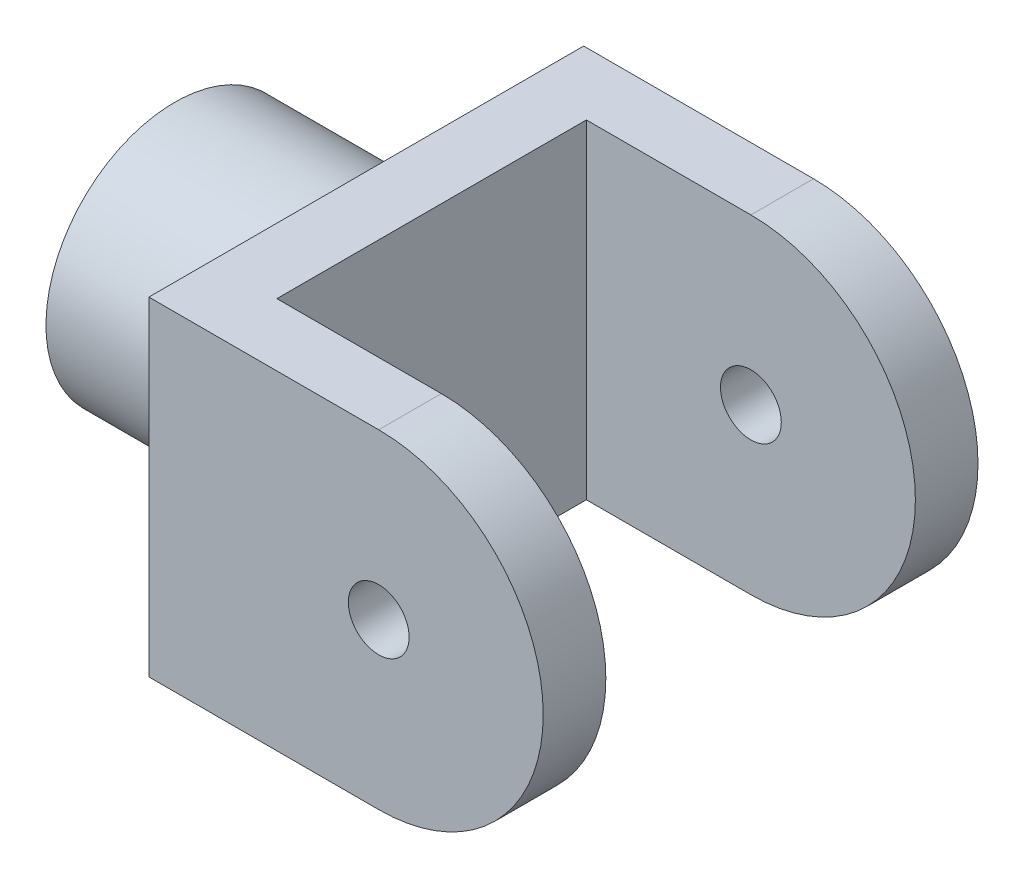
ISO-10303-21;
HEADER;
FILE_DESCRIPTION(('STEP AP214'),'2;1');
FILE_NAME('part.step','',(''),(''),'','','');
FILE_SCHEMA(('AUTOMOTIVE_DESIGN { 1 0 10303 214 1 1 1 1 }'));
ENDSEC;
DATA;
#1=APPLICATION_CONTEXT('core data for automotive mechanical design processes');
#2=APPLICATION_PROTOCOL_DEFINITION('international standard','automotive_design',2000,#1);
#3=PRODUCT_CONTEXT('',#1,'mechanical');
#4=PRODUCT('Part','Part','',(#3));
#5=PRODUCT_RELATED_PRODUCT_CATEGORY('part','',(#4));
#6=PRODUCT_DEFINITION_FORMATION('','',#4);
#7=PRODUCT_DEFINITION_CONTEXT('part definition',#1,'design');
#8=PRODUCT_DEFINITION('design','',#6,#7);
#9=PRODUCT_DEFINITION_SHAPE('','',#8);
#10=(LENGTH_UNIT() NAMED_UNIT(*) SI_UNIT(.MILLI.,.METRE.));
#11=(NAMED_UNIT(*) PLANE_ANGLE_UNIT() SI_UNIT($,.RADIAN.));
#12=(NAMED_UNIT(*) SI_UNIT($,.STERADIAN.) SOLID_ANGLE_UNIT());
#13=UNCERTAINTY_MEASURE_WITH_UNIT(LENGTH_MEASURE(1.E-05),#10,'distance_accuracy_value','');
#14=(GEOMETRIC_REPRESENTATION_CONTEXT(3) GLOBAL_UNCERTAINTY_ASSIGNED_CONTEXT((#13)) GLOBAL_UNIT_ASSIGNED_CONTEXT((#10,
#11,#12)) REPRESENTATION_CONTEXT('',''));
#15=CARTESIAN_POINT('',(0.,0.,0.));
#16=DIRECTION('',(0.,0.,1.));
#17=DIRECTION('',(1.,0.,0.));
#18=AXIS2_PLACEMENT_3D('',#15,#16,#17);
#19=CARTESIAN_POINT('',(0.,0.,-11.35));
#20=DIRECTION('',(0.,0.,1.));
#21=DIRECTION('',(1.,0.,0.));
#22=AXIS2_PLACEMENT_3D('',#19,#20,#21);
#23=CYLINDRICAL_SURFACE('',#22,8.5875);
#24=CARTESIAN_POINT('',(0.,0.,-8.08));
#25=DIRECTION('',(0.,0.,1.));
#26=DIRECTION('',(1.,0.,0.));
#27=AXIS2_PLACEMENT_3D('',#24,#25,#26);
#28=CIRCLE('',#27,8.5875);
#29=CARTESIAN_POINT('',(0.,-8.5875,-8.08));
#30=VERTEX_POINT('',#29);
#31=CARTESIAN_POINT('',(0.,8.5875,-8.08));
#32=VERTEX_POINT('',#31);
#33=EDGE_CURVE('E85',#30,#32,#28,.T.);
#34=ORIENTED_EDGE('',*,*,#33,.F.);
#35=DIRECTION('',(0.,0.,1.));
#36=VECTOR('',#35,1.);
#37=CARTESIAN_POINT('',(0.,-8.5875,-11.35));
#38=LINE('',#37,#36);
#39=CARTESIAN_POINT('',(0.,-8.5875,-11.35));
#40=VERTEX_POINT('',#39);
#41=EDGE_CURVE('E78',#40,#30,#38,.T.);
#42=ORIENTED_EDGE('',*,*,#41,.F.);
#43=CARTESIAN_POINT('',(0.,0.,-11.35));
#44=DIRECTION('',(0.,0.,-1.));
#45=DIRECTION('',(-1.,0.,0.));
#46=AXIS2_PLACEMENT_3D('',#43,#44,#45);
#47=CIRCLE('',#46,8.5875);
#48=CARTESIAN_POINT('',(0.,8.5875,-11.35));
#49=VERTEX_POINT('',#48);
#50=EDGE_CURVE('E208',#49,#40,#47,.T.);
#51=ORIENTED_EDGE('',*,*,#50,.F.);
#52=DIRECTION('',(0.,0.,1.));
#53=VECTOR('',#52,1.);
#54=CARTESIAN_POINT('',(0.,8.5875,-11.35));
#55=LINE('',#54,#53);
#56=EDGE_CURVE('E92',#49,#32,#55,.T.);
#57=ORIENTED_EDGE('',*,*,#56,.T.);
#58=EDGE_LOOP('',(#34,#42,#51,#57));
#59=FACE_BOUND('',#58,.T.);
#60=ADVANCED_FACE('F69',(#59),#23,.T.);
#61=CARTESIAN_POINT('',(0.,0.,-11.35));
#62=DIRECTION('',(0.,0.,1.));
#63=DIRECTION('',(1.,0.,0.));
#64=AXIS2_PLACEMENT_3D('',#61,#62,#63);
#65=CYLINDRICAL_SURFACE('',#64,1.5875);
#66=CARTESIAN_POINT('',(0.,0.,-11.35));
#67=DIRECTION('',(0.,0.,1.));
#68=DIRECTION('',(1.,0.,0.));
#69=AXIS2_PLACEMENT_3D('',#66,#67,#68);
#70=CIRCLE('',#69,1.5875);
#71=CARTESIAN_POINT('',(1.5875,0.,-11.35));
#72=VERTEX_POINT('',#71);
#73=EDGE_CURVE('E204',#72,#72,#70,.T.);
#74=ORIENTED_EDGE('',*,*,#73,.F.);
#75=EDGE_LOOP('',(#74));
#76=FACE_BOUND('',#75,.T.);
#77=CARTESIAN_POINT('',(0.,0.,-8.08));
#78=DIRECTION('',(0.,0.,1.));
#79=DIRECTION('',(1.,0.,0.));
#80=AXIS2_PLACEMENT_3D('',#77,#78,#79);
#81=CIRCLE('',#80,1.5875);
#82=CARTESIAN_POINT('',(1.5875,0.,-8.08));
#83=VERTEX_POINT('',#82);
#84=EDGE_CURVE('E148',#83,#83,#81,.F.);
#85=ORIENTED_EDGE('',*,*,#84,.F.);
#86=EDGE_LOOP('',(#85));
#87=FACE_BOUND('',#86,.T.);
#88=ADVANCED_FACE('F281',(#76,#87),#65,.F.);
#89=CARTESIAN_POINT('',(0.,0.,8.08));
#90=DIRECTION('',(0.,0.,1.));
#91=DIRECTION('',(1.,0.,0.));
#92=AXIS2_PLACEMENT_3D('',#89,#90,#91);
#93=CIRCLE('',#92,8.5875);
#94=CARTESIAN_POINT('',(0.,-8.5875,8.08));
#95=VERTEX_POINT('',#94);
#96=CARTESIAN_POINT('',(0.,8.5875,8.08));
#97=VERTEX_POINT('',#96);
#98=EDGE_CURVE('E181',#95,#97,#93,.T.);
#99=ORIENTED_EDGE('',*,*,#98,.T.);
#100=CARTESIAN_POINT('',(0.,8.5875,11.35));
#101=VERTEX_POINT('',#100);
#102=EDGE_CURVE('E221',#97,#101,#55,.T.);
#103=ORIENTED_EDGE('',*,*,#102,.T.);
#104=CARTESIAN_POINT('',(0.,0.,11.35));
#105=DIRECTION('',(0.,0.,-1.));
#106=DIRECTION('',(-1.,0.,0.));
#107=AXIS2_PLACEMENT_3D('',#104,#105,#106);
#108=CIRCLE('',#107,8.5875);
#109=CARTESIAN_POINT('',(0.,-8.5875,11.35));
#110=VERTEX_POINT('',#109);
#111=EDGE_CURVE('E188',#101,#110,#108,.T.);
#112=ORIENTED_EDGE('',*,*,#111,.T.);
#113=EDGE_CURVE('E230',#95,#110,#38,.T.);
#114=ORIENTED_EDGE('',*,*,#113,.F.);
#115=EDGE_LOOP('',(#99,#103,#112,#114));
#116=FACE_BOUND('',#115,.T.);
#117=ADVANCED_FACE('F71',(#116),#23,.T.);
#118=CARTESIAN_POINT('',(-12.,-8.5875,-11.35));
#119=DIRECTION('',(0.,-1.,0.));
#120=DIRECTION('',(0.,0.,-1.));
#121=AXIS2_PLACEMENT_3D('',#118,#119,#120);
#122=PLANE('',#121);
#123=DIRECTION('',(1.,0.,0.));
#124=VECTOR('',#123,1.);
#125=CARTESIAN_POINT('',(-8.5875,-8.5875,8.08));
#126=LINE('',#125,#124);
#127=CARTESIAN_POINT('',(-8.5875,-8.5875,8.08));
#128=VERTEX_POINT('',#127);
#129=EDGE_CURVE('E169',#128,#95,#126,.T.);
#130=ORIENTED_EDGE('',*,*,#129,.T.);
#131=ORIENTED_EDGE('',*,*,#113,.T.);
#132=DIRECTION('',(1.,0.,0.));
#133=VECTOR('',#132,1.);
#134=CARTESIAN_POINT('',(-12.,-8.5875,11.35));
#135=LINE('',#134,#133);
#136=CARTESIAN_POINT('',(-12.,-8.5875,11.35));
#137=VERTEX_POINT('',#136);
#138=EDGE_CURVE('E192',#137,#110,#135,.T.);
#139=ORIENTED_EDGE('',*,*,#138,.F.);
#140=DIRECTION('',(0.,0.,1.));
#141=VECTOR('',#140,1.);
#142=CARTESIAN_POINT('',(-12.,-8.5875,-11.35));
#143=LINE('',#142,#141);
#144=CARTESIAN_POINT('',(-12.,-8.5875,-11.35));
#145=VERTEX_POINT('',#144);
#146=EDGE_CURVE('E227',#145,#137,#143,.T.);
#147=ORIENTED_EDGE('',*,*,#146,.F.);
#148=DIRECTION('',(1.,0.,0.));
#149=VECTOR('',#148,1.);
#150=CARTESIAN_POINT('',(-12.,-8.5875,-11.35));
#151=LINE('',#150,#149);
#152=EDGE_CURVE('E211',#145,#40,#151,.T.);
#153=ORIENTED_EDGE('',*,*,#152,.T.);
#154=ORIENTED_EDGE('',*,*,#41,.T.);
#155=DIRECTION('',(1.,0.,0.));
#156=VECTOR('',#155,1.);
#157=CARTESIAN_POINT('',(-8.5875,-8.5875,-8.08));
#158=LINE('',#157,#156);
#159=CARTESIAN_POINT('',(-8.5875,-8.5875,-8.08));
#160=VERTEX_POINT('',#159);
#161=EDGE_CURVE('E152',#160,#30,#158,.T.);
#162=ORIENTED_EDGE('',*,*,#161,.F.);
#163=DIRECTION('',(0.,0.,-1.));
#164=VECTOR('',#163,1.);
#165=CARTESIAN_POINT('',(-8.5875,-8.5875,8.08));
#166=LINE('',#165,#164);
#167=EDGE_CURVE('E137',#128,#160,#166,.T.);
#168=ORIENTED_EDGE('',*,*,#167,.F.);
#169=EDGE_LOOP('',(#130,#131,#139,#147,#153,#154,#162,#168));
#170=FACE_BOUND('',#169,.T.);
#171=ADVANCED_FACE('F158',(#170),#122,.T.);
#172=CARTESIAN_POINT('',(-12.,8.5875,-11.35));
#173=DIRECTION('',(-1.,0.,0.));
#174=DIRECTION('',(0.,-1.,0.));
#175=AXIS2_PLACEMENT_3D('',#172,#173,#174);
#176=PLANE('',#175);
#177=CARTESIAN_POINT('',(-12.,0.,0.));
#178=DIRECTION('',(-1.,0.,0.));
#179=DIRECTION('',(0.,-1.,0.));
#180=AXIS2_PLACEMENT_3D('',#177,#178,#179);
#181=CIRCLE('',#180,6.7225);
#182=CARTESIAN_POINT('',(-12.,-6.7225,0.));
#183=VERTEX_POINT('',#182);
#184=EDGE_CURVE('E411',#183,#183,#181,.T.);
#185=ORIENTED_EDGE('',*,*,#184,.F.);
#186=EDGE_LOOP('',(#185));
#187=FACE_BOUND('',#186,.T.);
#188=ORIENTED_EDGE('',*,*,#146,.T.);
#189=DIRECTION('',(0.,-1.,0.));
#190=VECTOR('',#189,1.);
#191=CARTESIAN_POINT('',(-12.,8.5875,11.35));
#192=LINE('',#191,#190);
#193=CARTESIAN_POINT('',(-12.,8.5875,11.35));
#194=VERTEX_POINT('',#193);
#195=EDGE_CURVE('E196',#194,#137,#192,.T.);
#196=ORIENTED_EDGE('',*,*,#195,.F.);
#197=DIRECTION('',(0.,0.,1.));
#198=VECTOR('',#197,1.);
#199=CARTESIAN_POINT('',(-12.,8.5875,-11.35));
#200=LINE('',#199,#198);
#201=CARTESIAN_POINT('',(-12.,8.5875,-11.35));
#202=VERTEX_POINT('',#201);
#203=EDGE_CURVE('E224',#202,#194,#200,.T.);
#204=ORIENTED_EDGE('',*,*,#203,.F.);
#205=DIRECTION('',(0.,-1.,0.));
#206=VECTOR('',#205,1.);
#207=CARTESIAN_POINT('',(-12.,8.5875,-11.35));
#208=LINE('',#207,#206);
#209=EDGE_CURVE('E214',#202,#145,#208,.T.);
#210=ORIENTED_EDGE('',*,*,#209,.T.);
#211=EDGE_LOOP('',(#188,#196,#204,#210));
#212=FACE_BOUND('',#211,.T.);
#213=ADVANCED_FACE('F266',(#187,#212),#176,.T.);
#214=CARTESIAN_POINT('',(0.,8.5875,-11.35));
#215=DIRECTION('',(0.,1.,0.));
#216=DIRECTION('',(-1.,0.,0.));
#217=AXIS2_PLACEMENT_3D('',#214,#215,#216);
#218=PLANE('',#217);
#219=DIRECTION('',(-1.,0.,0.));
#220=VECTOR('',#219,1.);
#221=CARTESIAN_POINT('',(-8.5875,8.5875,8.08));
#222=LINE('',#221,#220);
#223=CARTESIAN_POINT('',(-8.5875,8.5875,8.08));
#224=VERTEX_POINT('',#223);
#225=EDGE_CURVE('E172',#97,#224,#222,.T.);
#226=ORIENTED_EDGE('',*,*,#225,.T.);
#227=DIRECTION('',(0.,0.,-1.));
#228=VECTOR('',#227,1.);
#229=CARTESIAN_POINT('',(-8.5875,8.5875,8.08));
#230=LINE('',#229,#228);
#231=CARTESIAN_POINT('',(-8.5875,8.5875,-8.08));
#232=VERTEX_POINT('',#231);
#233=EDGE_CURVE('E149',#224,#232,#230,.T.);
#234=ORIENTED_EDGE('',*,*,#233,.T.);
#235=DIRECTION('',(-1.,0.,0.));
#236=VECTOR('',#235,1.);
#237=CARTESIAN_POINT('',(-8.5875,8.5875,-8.08));
#238=LINE('',#237,#236);
#239=EDGE_CURVE('E154',#32,#232,#238,.T.);
#240=ORIENTED_EDGE('',*,*,#239,.F.);
#241=ORIENTED_EDGE('',*,*,#56,.F.);
#242=DIRECTION('',(-1.,0.,0.));
#243=VECTOR('',#242,1.);
#244=CARTESIAN_POINT('',(0.,8.5875,-11.35));
#245=LINE('',#244,#243);
#246=EDGE_CURVE('E218',#49,#202,#245,.T.);
#247=ORIENTED_EDGE('',*,*,#246,.T.);
#248=ORIENTED_EDGE('',*,*,#203,.T.);
#249=DIRECTION('',(-1.,0.,0.));
#250=VECTOR('',#249,1.);
#251=CARTESIAN_POINT('',(0.,8.5875,11.35));
#252=LINE('',#251,#250);
#253=EDGE_CURVE('E200',#101,#194,#252,.T.);
#254=ORIENTED_EDGE('',*,*,#253,.F.);
#255=ORIENTED_EDGE('',*,*,#102,.F.);
#256=EDGE_LOOP('',(#226,#234,#240,#241,#247,#248,#254,#255));
#257=FACE_BOUND('',#256,.T.);
#258=ADVANCED_FACE('F256',(#257),#218,.T.);
#259=CARTESIAN_POINT('',(0.,0.,-11.35));
#260=DIRECTION('',(0.,0.,-1.));
#261=DIRECTION('',(-1.,0.,0.));
#262=AXIS2_PLACEMENT_3D('',#259,#260,#261);
#263=PLANE('',#262);
#264=ORIENTED_EDGE('',*,*,#73,.T.);
#265=EDGE_LOOP('',(#264));
#266=FACE_BOUND('',#265,.T.);
#267=ORIENTED_EDGE('',*,*,#50,.T.);
#268=ORIENTED_EDGE('',*,*,#152,.F.);
#269=ORIENTED_EDGE('',*,*,#209,.F.);
#270=ORIENTED_EDGE('',*,*,#246,.F.);
#271=EDGE_LOOP('',(#267,#268,#269,#270));
#272=FACE_BOUND('',#271,.T.);
#273=ADVANCED_FACE('F264',(#266,#272),#263,.T.);
#274=CARTESIAN_POINT('',(0.,0.,8.08));
#275=DIRECTION('',(0.,0.,1.));
#276=DIRECTION('',(1.,0.,0.));
#277=AXIS2_PLACEMENT_3D('',#274,#275,#276);
#278=CIRCLE('',#277,1.5875);
#279=CARTESIAN_POINT('',(1.5875,0.,8.08));
#280=VERTEX_POINT('',#279);
#281=EDGE_CURVE('E180',#280,#280,#278,.F.);
#282=ORIENTED_EDGE('',*,*,#281,.T.);
#283=EDGE_LOOP('',(#282));
#284=FACE_BOUND('',#283,.T.);
#285=CARTESIAN_POINT('',(0.,0.,11.35));
#286=DIRECTION('',(0.,0.,1.));
#287=DIRECTION('',(1.,0.,0.));
#288=AXIS2_PLACEMENT_3D('',#285,#286,#287);
#289=CIRCLE('',#288,1.5875);
#290=CARTESIAN_POINT('',(1.5875,0.,11.35));
#291=VERTEX_POINT('',#290);
#292=EDGE_CURVE('E184',#291,#291,#289,.T.);
#293=ORIENTED_EDGE('',*,*,#292,.T.);
#294=EDGE_LOOP('',(#293));
#295=FACE_BOUND('',#294,.T.);
#296=ADVANCED_FACE('F239',(#284,#295),#65,.F.);
#297=CARTESIAN_POINT('',(0.,0.,11.35));
#298=DIRECTION('',(0.,0.,-1.));
#299=DIRECTION('',(-1.,0.,0.));
#300=AXIS2_PLACEMENT_3D('',#297,#298,#299);
#301=PLANE('',#300);
#302=ORIENTED_EDGE('',*,*,#111,.F.);
#303=ORIENTED_EDGE('',*,*,#253,.T.);
#304=ORIENTED_EDGE('',*,*,#195,.T.);
#305=ORIENTED_EDGE('',*,*,#138,.T.);
#306=EDGE_LOOP('',(#302,#303,#304,#305));
#307=FACE_BOUND('',#306,.T.);
#308=ORIENTED_EDGE('',*,*,#292,.F.);
#309=EDGE_LOOP('',(#308));
#310=FACE_BOUND('',#309,.T.);
#311=ADVANCED_FACE('F245',(#307,#310),#301,.F.);
#312=CARTESIAN_POINT('',(0.,0.,8.08));
#313=DIRECTION('',(0.,0.,1.));
#314=DIRECTION('',(1.,0.,0.));
#315=AXIS2_PLACEMENT_3D('',#312,#313,#314);
#316=PLANE('',#315);
#317=ORIENTED_EDGE('',*,*,#281,.F.);
#318=EDGE_LOOP('',(#317));
#319=FACE_BOUND('',#318,.T.);
#320=ORIENTED_EDGE('',*,*,#98,.F.);
#321=ORIENTED_EDGE('',*,*,#129,.F.);
#322=DIRECTION('',(0.,-1.,0.));
#323=VECTOR('',#322,1.);
#324=CARTESIAN_POINT('',(-8.5875,8.5875,8.08));
#325=LINE('',#324,#323);
#326=EDGE_CURVE('E143',#224,#128,#325,.T.);
#327=ORIENTED_EDGE('',*,*,#326,.F.);
#328=ORIENTED_EDGE('',*,*,#225,.F.);
#329=EDGE_LOOP('',(#320,#321,#327,#328));
#330=FACE_BOUND('',#329,.T.);
#331=ADVANCED_FACE('F242',(#319,#330),#316,.F.);
#332=CARTESIAN_POINT('',(0.,0.,-8.08));
#333=DIRECTION('',(0.,0.,1.));
#334=DIRECTION('',(1.,0.,0.));
#335=AXIS2_PLACEMENT_3D('',#332,#333,#334);
#336=PLANE('',#335);
#337=ORIENTED_EDGE('',*,*,#84,.T.);
#338=EDGE_LOOP('',(#337));
#339=FACE_BOUND('',#338,.T.);
#340=ORIENTED_EDGE('',*,*,#33,.T.);
#341=ORIENTED_EDGE('',*,*,#239,.T.);
#342=DIRECTION('',(0.,-1.,0.));
#343=VECTOR('',#342,1.);
#344=CARTESIAN_POINT('',(-8.5875,8.5875,-8.08));
#345=LINE('',#344,#343);
#346=EDGE_CURVE('E140',#232,#160,#345,.T.);
#347=ORIENTED_EDGE('',*,*,#346,.T.);
#348=ORIENTED_EDGE('',*,*,#161,.T.);
#349=EDGE_LOOP('',(#340,#341,#347,#348));
#350=FACE_BOUND('',#349,.T.);
#351=ADVANCED_FACE('F151',(#339,#350),#336,.T.);
#352=CARTESIAN_POINT('',(-8.5875,8.5875,8.08));
#353=DIRECTION('',(1.,0.,0.));
#354=DIRECTION('',(0.,0.,-1.));
#355=AXIS2_PLACEMENT_3D('',#352,#353,#354);
#356=PLANE('',#355);
#357=ORIENTED_EDGE('',*,*,#233,.F.);
#358=ORIENTED_EDGE('',*,*,#326,.T.);
#359=ORIENTED_EDGE('',*,*,#167,.T.);
#360=ORIENTED_EDGE('',*,*,#346,.F.);
#361=EDGE_LOOP('',(#357,#358,#359,#360));
#362=FACE_BOUND('',#361,.T.);
#363=ADVANCED_FACE('F139',(#362),#356,.T.);
#364=CARTESIAN_POINT('',(-22.,0.,0.));
#365=DIRECTION('',(-1.,0.,0.));
#366=DIRECTION('',(0.,-1.,0.));
#367=AXIS2_PLACEMENT_3D('',#364,#365,#366);
#368=PLANE('',#367);
#369=CARTESIAN_POINT('',(-22.,0.,0.));
#370=DIRECTION('',(-1.,0.,0.));
#371=DIRECTION('',(0.,-1.,0.));
#372=AXIS2_PLACEMENT_3D('',#369,#370,#371);
#373=CIRCLE('',#372,6.7225);
#374=CARTESIAN_POINT('',(-22.,-6.7225,0.));
#375=VERTEX_POINT('',#374);
#376=EDGE_CURVE('E156',#375,#375,#373,.T.);
#377=ORIENTED_EDGE('',*,*,#376,.T.);
#378=EDGE_LOOP('',(#377));
#379=FACE_BOUND('',#378,.T.);
#380=CARTESIAN_POINT('',(-22.,0.,0.));
#381=DIRECTION('',(-1.,0.,0.));
#382=DIRECTION('',(0.,-1.,0.));
#383=AXIS2_PLACEMENT_3D('',#380,#381,#382);
#384=CIRCLE('',#383,4.7225);
#385=CARTESIAN_POINT('',(-22.,-4.7225,0.));
#386=VERTEX_POINT('',#385);
#387=EDGE_CURVE('E407',#386,#386,#384,.T.);
#388=ORIENTED_EDGE('',*,*,#387,.F.);
#389=EDGE_LOOP('',(#388));
#390=FACE_BOUND('',#389,.T.);
#391=ADVANCED_FACE('F339',(#379,#390),#368,.T.);
#392=CARTESIAN_POINT('',(-22.,0.,0.));
#393=DIRECTION('',(1.,0.,0.));
#394=DIRECTION('',(0.,1.,0.));
#395=AXIS2_PLACEMENT_3D('',#392,#393,#394);
#396=CYLINDRICAL_SURFACE('',#395,6.7225);
#397=ORIENTED_EDGE('',*,*,#376,.F.);
#398=EDGE_LOOP('',(#397));
#399=FACE_BOUND('',#398,.T.);
#400=ORIENTED_EDGE('',*,*,#184,.T.);
#401=EDGE_LOOP('',(#400));
#402=FACE_BOUND('',#401,.T.);
#403=ADVANCED_FACE('F353',(#399,#402),#396,.T.);
#404=CARTESIAN_POINT('',(-22.,0.,0.));
#405=DIRECTION('',(1.,0.,0.));
#406=DIRECTION('',(0.,1.,0.));
#407=AXIS2_PLACEMENT_3D('',#404,#405,#406);
#408=CYLINDRICAL_SURFACE('',#407,4.7225);
#409=ORIENTED_EDGE('',*,*,#387,.T.);
#410=EDGE_LOOP('',(#409));
#411=FACE_BOUND('',#410,.T.);
#412=CARTESIAN_POINT('',(-12.,0.,0.));
#413=DIRECTION('',(-1.,0.,0.));
#414=DIRECTION('',(0.,-1.,0.));
#415=AXIS2_PLACEMENT_3D('',#412,#413,#414);
#416=CIRCLE('',#415,4.7225);
#417=CARTESIAN_POINT('',(-12.,-4.7225,0.));
#418=VERTEX_POINT('',#417);
#419=EDGE_CURVE('E12',#418,#418,#416,.F.);
#420=ORIENTED_EDGE('',*,*,#419,.T.);
#421=EDGE_LOOP('',(#420));
#422=FACE_BOUND('',#421,.T.);
#423=ADVANCED_FACE('F278',(#411,#422),#408,.F.);
#424=ORIENTED_EDGE('',*,*,#419,.F.);
#425=EDGE_LOOP('',(#424));
#426=FACE_BOUND('',#425,.T.);
#427=ADVANCED_FACE('F270',(#426),#176,.T.);
#428=CLOSED_SHELL('',(#60,#88,#117,#171,#213,#258,#273,#296,#311,#331,#351,#363,#391,#403,#423,#427));
#429=MANIFOLD_SOLID_BREP('B2',#428);
#430=ADVANCED_BREP_SHAPE_REPRESENTATION('',(#18,#429),#14);
#431=SHAPE_DEFINITION_REPRESENTATION(#9,#430);
ENDSEC;
END-ISO-10303-21;
